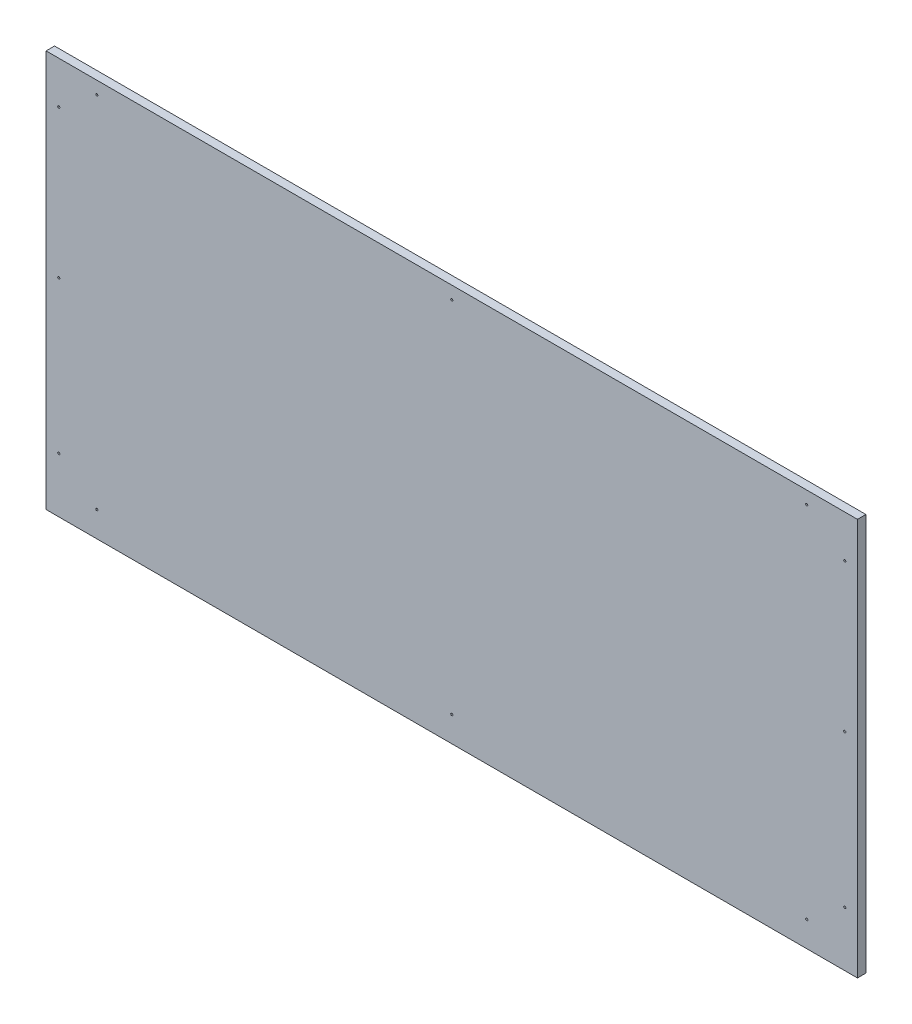
ISO-10303-21;
HEADER;
FILE_DESCRIPTION(('STEP AP214'),'2;1');
FILE_NAME('part.step','',(''),(''),'','','');
FILE_SCHEMA(('AUTOMOTIVE_DESIGN { 1 0 10303 214 1 1 1 1 }'));
ENDSEC;
DATA;
#1=APPLICATION_CONTEXT('core data for automotive mechanical design processes');
#2=APPLICATION_PROTOCOL_DEFINITION('international standard','automotive_design',2000,#1);
#3=PRODUCT_CONTEXT('',#1,'mechanical');
#4=PRODUCT('Part','Part','',(#3));
#5=PRODUCT_RELATED_PRODUCT_CATEGORY('part','',(#4));
#6=PRODUCT_DEFINITION_FORMATION('','',#4);
#7=PRODUCT_DEFINITION_CONTEXT('part definition',#1,'design');
#8=PRODUCT_DEFINITION('design','',#6,#7);
#9=PRODUCT_DEFINITION_SHAPE('','',#8);
#10=(LENGTH_UNIT() NAMED_UNIT(*) SI_UNIT(.MILLI.,.METRE.));
#11=(NAMED_UNIT(*) PLANE_ANGLE_UNIT() SI_UNIT($,.RADIAN.));
#12=(NAMED_UNIT(*) SI_UNIT($,.STERADIAN.) SOLID_ANGLE_UNIT());
#13=UNCERTAINTY_MEASURE_WITH_UNIT(LENGTH_MEASURE(1.E-05),#10,'distance_accuracy_value','');
#14=(GEOMETRIC_REPRESENTATION_CONTEXT(3) GLOBAL_UNCERTAINTY_ASSIGNED_CONTEXT((#13)) GLOBAL_UNIT_ASSIGNED_CONTEXT((#10,
#11,#12)) REPRESENTATION_CONTEXT('',''));
#15=CARTESIAN_POINT('',(0.,0.,0.));
#16=DIRECTION('',(0.,0.,1.));
#17=DIRECTION('',(1.,0.,0.));
#18=AXIS2_PLACEMENT_3D('',#15,#16,#17);
#19=CARTESIAN_POINT('',(0.,0.,-615.95));
#20=DIRECTION('',(0.,0.,-1.));
#21=DIRECTION('',(-1.,0.,0.));
#22=AXIS2_PLACEMENT_3D('',#19,#20,#21);
#23=PLANE('',#22);
#24=CARTESIAN_POINT('',(-590.55,533.4,-615.95));
#25=DIRECTION('',(0.,0.,-1.));
#26=DIRECTION('',(-1.,0.,0.));
#27=AXIS2_PLACEMENT_3D('',#24,#25,#26);
#28=CIRCLE('',#27,1.5875);
#29=CARTESIAN_POINT('',(-592.1375,533.4,-615.95));
#30=VERTEX_POINT('',#29);
#31=EDGE_CURVE('E115',#30,#30,#28,.F.);
#32=ORIENTED_EDGE('',*,*,#31,.T.);
#33=EDGE_LOOP('',(#32));
#34=FACE_BOUND('',#33,.T.);
#35=CARTESIAN_POINT('',(-590.55,82.55,-615.95));
#36=DIRECTION('',(0.,0.,-1.));
#37=DIRECTION('',(-1.,0.,0.));
#38=AXIS2_PLACEMENT_3D('',#35,#36,#37);
#39=CIRCLE('',#38,1.5875);
#40=CARTESIAN_POINT('',(-592.1375,82.55,-615.95));
#41=VERTEX_POINT('',#40);
#42=EDGE_CURVE('E118',#41,#41,#39,.F.);
#43=ORIENTED_EDGE('',*,*,#42,.T.);
#44=EDGE_LOOP('',(#43));
#45=FACE_BOUND('',#44,.T.);
#46=CARTESIAN_POINT('',(590.55,82.55,-615.95));
#47=DIRECTION('',(0.,0.,-1.));
#48=DIRECTION('',(-1.,0.,0.));
#49=AXIS2_PLACEMENT_3D('',#46,#47,#48);
#50=CIRCLE('',#49,1.5875);
#51=CARTESIAN_POINT('',(588.9625,82.55,-615.95));
#52=VERTEX_POINT('',#51);
#53=EDGE_CURVE('E121',#52,#52,#50,.F.);
#54=ORIENTED_EDGE('',*,*,#53,.T.);
#55=EDGE_LOOP('',(#54));
#56=FACE_BOUND('',#55,.T.);
#57=CARTESIAN_POINT('',(590.55,533.4,-615.95));
#58=DIRECTION('',(0.,0.,-1.));
#59=DIRECTION('',(-1.,0.,0.));
#60=AXIS2_PLACEMENT_3D('',#57,#58,#59);
#61=CIRCLE('',#60,1.5875);
#62=CARTESIAN_POINT('',(588.9625,533.4,-615.95));
#63=VERTEX_POINT('',#62);
#64=EDGE_CURVE('E124',#63,#63,#61,.F.);
#65=ORIENTED_EDGE('',*,*,#64,.T.);
#66=EDGE_LOOP('',(#65));
#67=FACE_BOUND('',#66,.T.);
#68=CARTESIAN_POINT('',(-590.55,311.15,-615.95));
#69=DIRECTION('',(0.,0.,-1.));
#70=DIRECTION('',(-1.,0.,0.));
#71=AXIS2_PLACEMENT_3D('',#68,#69,#70);
#72=CIRCLE('',#71,1.5875);
#73=CARTESIAN_POINT('',(-592.1375,311.15,-615.95));
#74=VERTEX_POINT('',#73);
#75=EDGE_CURVE('E127',#74,#74,#72,.F.);
#76=ORIENTED_EDGE('',*,*,#75,.T.);
#77=EDGE_LOOP('',(#76));
#78=FACE_BOUND('',#77,.T.);
#79=CARTESIAN_POINT('',(590.55,311.15,-615.95));
#80=DIRECTION('',(0.,0.,-1.));
#81=DIRECTION('',(-1.,0.,0.));
#82=AXIS2_PLACEMENT_3D('',#79,#80,#81);
#83=CIRCLE('',#82,1.5875);
#84=CARTESIAN_POINT('',(588.9625,311.15,-615.95));
#85=VERTEX_POINT('',#84);
#86=EDGE_CURVE('E130',#85,#85,#83,.F.);
#87=ORIENTED_EDGE('',*,*,#86,.T.);
#88=EDGE_LOOP('',(#87));
#89=FACE_BOUND('',#88,.T.);
#90=CARTESIAN_POINT('',(-533.4,38.1,-615.95));
#91=DIRECTION('',(0.,0.,-1.));
#92=DIRECTION('',(-1.,0.,0.));
#93=AXIS2_PLACEMENT_3D('',#90,#91,#92);
#94=CIRCLE('',#93,1.5875);
#95=CARTESIAN_POINT('',(-534.9875,38.1,-615.95));
#96=VERTEX_POINT('',#95);
#97=EDGE_CURVE('E133',#96,#96,#94,.F.);
#98=ORIENTED_EDGE('',*,*,#97,.T.);
#99=EDGE_LOOP('',(#98));
#100=FACE_BOUND('',#99,.T.);
#101=CARTESIAN_POINT('',(0.,38.1,-615.95));
#102=DIRECTION('',(0.,0.,-1.));
#103=DIRECTION('',(-1.,0.,0.));
#104=AXIS2_PLACEMENT_3D('',#101,#102,#103);
#105=CIRCLE('',#104,1.5875);
#106=CARTESIAN_POINT('',(-1.5875,38.1,-615.95));
#107=VERTEX_POINT('',#106);
#108=EDGE_CURVE('E136',#107,#107,#105,.F.);
#109=ORIENTED_EDGE('',*,*,#108,.T.);
#110=EDGE_LOOP('',(#109));
#111=FACE_BOUND('',#110,.T.);
#112=CARTESIAN_POINT('',(533.4,38.1,-615.95));
#113=DIRECTION('',(0.,0.,-1.));
#114=DIRECTION('',(-1.,0.,0.));
#115=AXIS2_PLACEMENT_3D('',#112,#113,#114);
#116=CIRCLE('',#115,1.5875);
#117=CARTESIAN_POINT('',(531.8125,38.1,-615.95));
#118=VERTEX_POINT('',#117);
#119=EDGE_CURVE('E139',#118,#118,#116,.F.);
#120=ORIENTED_EDGE('',*,*,#119,.T.);
#121=EDGE_LOOP('',(#120));
#122=FACE_BOUND('',#121,.T.);
#123=CARTESIAN_POINT('',(-533.4,577.85,-615.95));
#124=DIRECTION('',(0.,0.,-1.));
#125=DIRECTION('',(-1.,0.,0.));
#126=AXIS2_PLACEMENT_3D('',#123,#124,#125);
#127=CIRCLE('',#126,1.5875);
#128=CARTESIAN_POINT('',(-534.9875,577.85,-615.95));
#129=VERTEX_POINT('',#128);
#130=EDGE_CURVE('E142',#129,#129,#127,.F.);
#131=ORIENTED_EDGE('',*,*,#130,.T.);
#132=EDGE_LOOP('',(#131));
#133=FACE_BOUND('',#132,.T.);
#134=CARTESIAN_POINT('',(0.,577.85,-615.95));
#135=DIRECTION('',(0.,0.,-1.));
#136=DIRECTION('',(-1.,0.,0.));
#137=AXIS2_PLACEMENT_3D('',#134,#135,#136);
#138=CIRCLE('',#137,1.5875);
#139=CARTESIAN_POINT('',(-1.5875,577.85,-615.95));
#140=VERTEX_POINT('',#139);
#141=EDGE_CURVE('E144',#140,#140,#138,.F.);
#142=ORIENTED_EDGE('',*,*,#141,.T.);
#143=EDGE_LOOP('',(#142));
#144=FACE_BOUND('',#143,.T.);
#145=CARTESIAN_POINT('',(533.4,577.85,-615.95));
#146=DIRECTION('',(0.,0.,-1.));
#147=DIRECTION('',(-1.,0.,0.));
#148=AXIS2_PLACEMENT_3D('',#145,#146,#147);
#149=CIRCLE('',#148,1.5875);
#150=CARTESIAN_POINT('',(531.8125,577.85,-615.95));
#151=VERTEX_POINT('',#150);
#152=EDGE_CURVE('E19',#151,#151,#149,.F.);
#153=ORIENTED_EDGE('',*,*,#152,.T.);
#154=EDGE_LOOP('',(#153));
#155=FACE_BOUND('',#154,.T.);
#156=DIRECTION('',(0.,1.,0.));
#157=VECTOR('',#156,1.);
#158=CARTESIAN_POINT('',(609.6,596.9,-615.95));
#159=LINE('',#158,#157);
#160=CARTESIAN_POINT('',(609.6,0.,-615.95));
#161=VERTEX_POINT('',#160);
#162=CARTESIAN_POINT('',(609.6,596.9,-615.95));
#163=VERTEX_POINT('',#162);
#164=EDGE_CURVE('E70',#161,#163,#159,.T.);
#165=ORIENTED_EDGE('',*,*,#164,.F.);
#166=DIRECTION('',(1.,0.,0.));
#167=VECTOR('',#166,1.);
#168=CARTESIAN_POINT('',(609.6,0.,-615.95));
#169=LINE('',#168,#167);
#170=CARTESIAN_POINT('',(-609.6,0.,-615.95));
#171=VERTEX_POINT('',#170);
#172=EDGE_CURVE('E67',#171,#161,#169,.T.);
#173=ORIENTED_EDGE('',*,*,#172,.F.);
#174=DIRECTION('',(0.,1.,0.));
#175=VECTOR('',#174,1.);
#176=CARTESIAN_POINT('',(-609.6,0.,-615.95));
#177=LINE('',#176,#175);
#178=CARTESIAN_POINT('',(-609.6,596.9,-615.95));
#179=VERTEX_POINT('',#178);
#180=EDGE_CURVE('E58',#179,#171,#177,.F.);
#181=ORIENTED_EDGE('',*,*,#180,.F.);
#182=DIRECTION('',(1.,0.,0.));
#183=VECTOR('',#182,1.);
#184=CARTESIAN_POINT('',(-609.6,596.9,-615.95));
#185=LINE('',#184,#183);
#186=EDGE_CURVE('E53',#163,#179,#185,.F.);
#187=ORIENTED_EDGE('',*,*,#186,.F.);
#188=EDGE_LOOP('',(#165,#173,#181,#187));
#189=FACE_BOUND('',#188,.T.);
#190=ADVANCED_FACE('F16',(#34,#45,#56,#67,#78,#89,#100,#111,#122,#133,#144,#155,#189),#23,.T.);
#191=CARTESIAN_POINT('',(609.6,0.,-603.25));
#192=DIRECTION('',(0.,-1.,0.));
#193=DIRECTION('',(0.,0.,-1.));
#194=AXIS2_PLACEMENT_3D('',#191,#192,#193);
#195=PLANE('',#194);
#196=DIRECTION('',(0.,0.,-1.));
#197=VECTOR('',#196,1.);
#198=CARTESIAN_POINT('',(609.6,0.,-603.25));
#199=LINE('',#198,#197);
#200=CARTESIAN_POINT('',(609.6,0.,-603.25));
#201=VERTEX_POINT('',#200);
#202=EDGE_CURVE('E152',#201,#161,#199,.T.);
#203=ORIENTED_EDGE('',*,*,#202,.F.);
#204=DIRECTION('',(-1.,0.,0.));
#205=VECTOR('',#204,1.);
#206=CARTESIAN_POINT('',(0.,0.,-603.25));
#207=LINE('',#206,#205);
#208=CARTESIAN_POINT('',(-609.6,0.,-603.25));
#209=VERTEX_POINT('',#208);
#210=EDGE_CURVE('E77',#201,#209,#207,.T.);
#211=ORIENTED_EDGE('',*,*,#210,.T.);
#212=DIRECTION('',(0.,0.,1.));
#213=VECTOR('',#212,1.);
#214=CARTESIAN_POINT('',(-609.6,0.,-603.25));
#215=LINE('',#214,#213);
#216=EDGE_CURVE('E63',#171,#209,#215,.T.);
#217=ORIENTED_EDGE('',*,*,#216,.F.);
#218=ORIENTED_EDGE('',*,*,#172,.T.);
#219=EDGE_LOOP('',(#203,#211,#217,#218));
#220=FACE_BOUND('',#219,.T.);
#221=ADVANCED_FACE('F76',(#220),#195,.T.);
#222=CARTESIAN_POINT('',(-609.6,0.,-603.25));
#223=DIRECTION('',(-1.,0.,0.));
#224=DIRECTION('',(0.,0.,1.));
#225=AXIS2_PLACEMENT_3D('',#222,#223,#224);
#226=PLANE('',#225);
#227=ORIENTED_EDGE('',*,*,#216,.T.);
#228=DIRECTION('',(0.,1.,0.));
#229=VECTOR('',#228,1.);
#230=CARTESIAN_POINT('',(-609.6,0.,-603.25));
#231=LINE('',#230,#229);
#232=CARTESIAN_POINT('',(-609.6,596.9,-603.25));
#233=VERTEX_POINT('',#232);
#234=EDGE_CURVE('E163',#209,#233,#231,.T.);
#235=ORIENTED_EDGE('',*,*,#234,.T.);
#236=DIRECTION('',(0.,0.,1.));
#237=VECTOR('',#236,1.);
#238=CARTESIAN_POINT('',(-609.6,596.9,-603.25));
#239=LINE('',#238,#237);
#240=EDGE_CURVE('E65',#179,#233,#239,.T.);
#241=ORIENTED_EDGE('',*,*,#240,.F.);
#242=ORIENTED_EDGE('',*,*,#180,.T.);
#243=EDGE_LOOP('',(#227,#235,#241,#242));
#244=FACE_BOUND('',#243,.T.);
#245=ADVANCED_FACE('F60',(#244),#226,.T.);
#246=CARTESIAN_POINT('',(-609.6,596.9,-603.25));
#247=DIRECTION('',(0.,1.,0.));
#248=DIRECTION('',(0.,0.,1.));
#249=AXIS2_PLACEMENT_3D('',#246,#247,#248);
#250=PLANE('',#249);
#251=ORIENTED_EDGE('',*,*,#240,.T.);
#252=DIRECTION('',(-1.,0.,0.));
#253=VECTOR('',#252,1.);
#254=CARTESIAN_POINT('',(0.,596.9,-603.25));
#255=LINE('',#254,#253);
#256=CARTESIAN_POINT('',(609.6,596.9,-603.25));
#257=VERTEX_POINT('',#256);
#258=EDGE_CURVE('E160',#233,#257,#255,.F.);
#259=ORIENTED_EDGE('',*,*,#258,.T.);
#260=DIRECTION('',(0.,0.,-1.));
#261=VECTOR('',#260,1.);
#262=CARTESIAN_POINT('',(609.6,596.9,-603.25));
#263=LINE('',#262,#261);
#264=EDGE_CURVE('E34',#163,#257,#263,.F.);
#265=ORIENTED_EDGE('',*,*,#264,.F.);
#266=ORIENTED_EDGE('',*,*,#186,.T.);
#267=EDGE_LOOP('',(#251,#259,#265,#266));
#268=FACE_BOUND('',#267,.T.);
#269=ADVANCED_FACE('F159',(#268),#250,.T.);
#270=CARTESIAN_POINT('',(609.6,596.9,-603.25));
#271=DIRECTION('',(1.,0.,0.));
#272=DIRECTION('',(0.,0.,-1.));
#273=AXIS2_PLACEMENT_3D('',#270,#271,#272);
#274=PLANE('',#273);
#275=ORIENTED_EDGE('',*,*,#264,.T.);
#276=DIRECTION('',(0.,1.,0.));
#277=VECTOR('',#276,1.);
#278=CARTESIAN_POINT('',(609.6,0.,-603.25));
#279=LINE('',#278,#277);
#280=EDGE_CURVE('E114',#257,#201,#279,.F.);
#281=ORIENTED_EDGE('',*,*,#280,.T.);
#282=ORIENTED_EDGE('',*,*,#202,.T.);
#283=ORIENTED_EDGE('',*,*,#164,.T.);
#284=EDGE_LOOP('',(#275,#281,#282,#283));
#285=FACE_BOUND('',#284,.T.);
#286=ADVANCED_FACE('F166',(#285),#274,.T.);
#287=CARTESIAN_POINT('',(533.4,577.85,-615.95));
#288=DIRECTION('',(0.,0.,-1.));
#289=DIRECTION('',(-1.,0.,0.));
#290=AXIS2_PLACEMENT_3D('',#287,#288,#289);
#291=CYLINDRICAL_SURFACE('',#290,1.5875);
#292=ORIENTED_EDGE('',*,*,#152,.F.);
#293=EDGE_LOOP('',(#292));
#294=FACE_BOUND('',#293,.T.);
#295=CARTESIAN_POINT('',(533.4,577.85,-603.25));
#296=DIRECTION('',(0.,0.,-1.));
#297=DIRECTION('',(-1.,0.,0.));
#298=AXIS2_PLACEMENT_3D('',#295,#296,#297);
#299=CIRCLE('',#298,1.5875);
#300=CARTESIAN_POINT('',(531.8125,577.85,-603.25));
#301=VERTEX_POINT('',#300);
#302=EDGE_CURVE('E111',#301,#301,#299,.F.);
#303=ORIENTED_EDGE('',*,*,#302,.T.);
#304=EDGE_LOOP('',(#303));
#305=FACE_BOUND('',#304,.T.);
#306=ADVANCED_FACE('F168',(#294,#305),#291,.F.);
#307=CARTESIAN_POINT('',(0.,577.85,-615.95));
#308=DIRECTION('',(0.,0.,-1.));
#309=DIRECTION('',(-1.,0.,0.));
#310=AXIS2_PLACEMENT_3D('',#307,#308,#309);
#311=CYLINDRICAL_SURFACE('',#310,1.5875);
#312=ORIENTED_EDGE('',*,*,#141,.F.);
#313=EDGE_LOOP('',(#312));
#314=FACE_BOUND('',#313,.T.);
#315=CARTESIAN_POINT('',(0.,577.85,-603.25));
#316=DIRECTION('',(0.,0.,-1.));
#317=DIRECTION('',(-1.,0.,0.));
#318=AXIS2_PLACEMENT_3D('',#315,#316,#317);
#319=CIRCLE('',#318,1.5875);
#320=CARTESIAN_POINT('',(-1.5875,577.85,-603.25));
#321=VERTEX_POINT('',#320);
#322=EDGE_CURVE('E108',#321,#321,#319,.F.);
#323=ORIENTED_EDGE('',*,*,#322,.T.);
#324=EDGE_LOOP('',(#323));
#325=FACE_BOUND('',#324,.T.);
#326=ADVANCED_FACE('F175',(#314,#325),#311,.F.);
#327=CARTESIAN_POINT('',(-533.4,577.85,-615.95));
#328=DIRECTION('',(0.,0.,-1.));
#329=DIRECTION('',(-1.,0.,0.));
#330=AXIS2_PLACEMENT_3D('',#327,#328,#329);
#331=CYLINDRICAL_SURFACE('',#330,1.5875);
#332=ORIENTED_EDGE('',*,*,#130,.F.);
#333=EDGE_LOOP('',(#332));
#334=FACE_BOUND('',#333,.T.);
#335=CARTESIAN_POINT('',(-533.4,577.85,-603.25));
#336=DIRECTION('',(0.,0.,-1.));
#337=DIRECTION('',(-1.,0.,0.));
#338=AXIS2_PLACEMENT_3D('',#335,#336,#337);
#339=CIRCLE('',#338,1.5875);
#340=CARTESIAN_POINT('',(-534.9875,577.85,-603.25));
#341=VERTEX_POINT('',#340);
#342=EDGE_CURVE('E105',#341,#341,#339,.F.);
#343=ORIENTED_EDGE('',*,*,#342,.T.);
#344=EDGE_LOOP('',(#343));
#345=FACE_BOUND('',#344,.T.);
#346=ADVANCED_FACE('F222',(#334,#345),#331,.F.);
#347=CARTESIAN_POINT('',(533.4,38.1,-615.95));
#348=DIRECTION('',(0.,0.,-1.));
#349=DIRECTION('',(-1.,0.,0.));
#350=AXIS2_PLACEMENT_3D('',#347,#348,#349);
#351=CYLINDRICAL_SURFACE('',#350,1.5875);
#352=ORIENTED_EDGE('',*,*,#119,.F.);
#353=EDGE_LOOP('',(#352));
#354=FACE_BOUND('',#353,.T.);
#355=CARTESIAN_POINT('',(533.4,38.1,-603.25));
#356=DIRECTION('',(0.,0.,-1.));
#357=DIRECTION('',(-1.,0.,0.));
#358=AXIS2_PLACEMENT_3D('',#355,#356,#357);
#359=CIRCLE('',#358,1.5875);
#360=CARTESIAN_POINT('',(531.8125,38.1,-603.25));
#361=VERTEX_POINT('',#360);
#362=EDGE_CURVE('E102',#361,#361,#359,.F.);
#363=ORIENTED_EDGE('',*,*,#362,.T.);
#364=EDGE_LOOP('',(#363));
#365=FACE_BOUND('',#364,.T.);
#366=ADVANCED_FACE('F218',(#354,#365),#351,.F.);
#367=CARTESIAN_POINT('',(0.,38.1,-615.95));
#368=DIRECTION('',(0.,0.,-1.));
#369=DIRECTION('',(-1.,0.,0.));
#370=AXIS2_PLACEMENT_3D('',#367,#368,#369);
#371=CYLINDRICAL_SURFACE('',#370,1.5875);
#372=ORIENTED_EDGE('',*,*,#108,.F.);
#373=EDGE_LOOP('',(#372));
#374=FACE_BOUND('',#373,.T.);
#375=CARTESIAN_POINT('',(0.,38.1,-603.25));
#376=DIRECTION('',(0.,0.,-1.));
#377=DIRECTION('',(-1.,0.,0.));
#378=AXIS2_PLACEMENT_3D('',#375,#376,#377);
#379=CIRCLE('',#378,1.5875);
#380=CARTESIAN_POINT('',(-1.5875,38.1,-603.25));
#381=VERTEX_POINT('',#380);
#382=EDGE_CURVE('E99',#381,#381,#379,.F.);
#383=ORIENTED_EDGE('',*,*,#382,.T.);
#384=EDGE_LOOP('',(#383));
#385=FACE_BOUND('',#384,.T.);
#386=ADVANCED_FACE('F214',(#374,#385),#371,.F.);
#387=CARTESIAN_POINT('',(-533.4,38.1,-615.95));
#388=DIRECTION('',(0.,0.,-1.));
#389=DIRECTION('',(-1.,0.,0.));
#390=AXIS2_PLACEMENT_3D('',#387,#388,#389);
#391=CYLINDRICAL_SURFACE('',#390,1.5875);
#392=ORIENTED_EDGE('',*,*,#97,.F.);
#393=EDGE_LOOP('',(#392));
#394=FACE_BOUND('',#393,.T.);
#395=CARTESIAN_POINT('',(-533.4,38.1,-603.25));
#396=DIRECTION('',(0.,0.,-1.));
#397=DIRECTION('',(-1.,0.,0.));
#398=AXIS2_PLACEMENT_3D('',#395,#396,#397);
#399=CIRCLE('',#398,1.5875);
#400=CARTESIAN_POINT('',(-534.9875,38.1,-603.25));
#401=VERTEX_POINT('',#400);
#402=EDGE_CURVE('E96',#401,#401,#399,.F.);
#403=ORIENTED_EDGE('',*,*,#402,.T.);
#404=EDGE_LOOP('',(#403));
#405=FACE_BOUND('',#404,.T.);
#406=ADVANCED_FACE('F210',(#394,#405),#391,.F.);
#407=CARTESIAN_POINT('',(590.55,311.15,-615.95));
#408=DIRECTION('',(0.,0.,-1.));
#409=DIRECTION('',(-1.,0.,0.));
#410=AXIS2_PLACEMENT_3D('',#407,#408,#409);
#411=CYLINDRICAL_SURFACE('',#410,1.5875);
#412=ORIENTED_EDGE('',*,*,#86,.F.);
#413=EDGE_LOOP('',(#412));
#414=FACE_BOUND('',#413,.T.);
#415=CARTESIAN_POINT('',(590.55,311.15,-603.25));
#416=DIRECTION('',(0.,0.,-1.));
#417=DIRECTION('',(-1.,0.,0.));
#418=AXIS2_PLACEMENT_3D('',#415,#416,#417);
#419=CIRCLE('',#418,1.5875);
#420=CARTESIAN_POINT('',(588.9625,311.15,-603.25));
#421=VERTEX_POINT('',#420);
#422=EDGE_CURVE('E93',#421,#421,#419,.F.);
#423=ORIENTED_EDGE('',*,*,#422,.T.);
#424=EDGE_LOOP('',(#423));
#425=FACE_BOUND('',#424,.T.);
#426=ADVANCED_FACE('F206',(#414,#425),#411,.F.);
#427=CARTESIAN_POINT('',(-590.55,311.15,-615.95));
#428=DIRECTION('',(0.,0.,-1.));
#429=DIRECTION('',(-1.,0.,0.));
#430=AXIS2_PLACEMENT_3D('',#427,#428,#429);
#431=CYLINDRICAL_SURFACE('',#430,1.5875);
#432=ORIENTED_EDGE('',*,*,#75,.F.);
#433=EDGE_LOOP('',(#432));
#434=FACE_BOUND('',#433,.T.);
#435=CARTESIAN_POINT('',(-590.55,311.15,-603.25));
#436=DIRECTION('',(0.,0.,-1.));
#437=DIRECTION('',(-1.,0.,0.));
#438=AXIS2_PLACEMENT_3D('',#435,#436,#437);
#439=CIRCLE('',#438,1.5875);
#440=CARTESIAN_POINT('',(-592.1375,311.15,-603.25));
#441=VERTEX_POINT('',#440);
#442=EDGE_CURVE('E90',#441,#441,#439,.F.);
#443=ORIENTED_EDGE('',*,*,#442,.T.);
#444=EDGE_LOOP('',(#443));
#445=FACE_BOUND('',#444,.T.);
#446=ADVANCED_FACE('F202',(#434,#445),#431,.F.);
#447=CARTESIAN_POINT('',(590.55,533.4,-615.95));
#448=DIRECTION('',(0.,0.,-1.));
#449=DIRECTION('',(-1.,0.,0.));
#450=AXIS2_PLACEMENT_3D('',#447,#448,#449);
#451=CYLINDRICAL_SURFACE('',#450,1.5875);
#452=ORIENTED_EDGE('',*,*,#64,.F.);
#453=EDGE_LOOP('',(#452));
#454=FACE_BOUND('',#453,.T.);
#455=CARTESIAN_POINT('',(590.55,533.4,-603.25));
#456=DIRECTION('',(0.,0.,-1.));
#457=DIRECTION('',(-1.,0.,0.));
#458=AXIS2_PLACEMENT_3D('',#455,#456,#457);
#459=CIRCLE('',#458,1.5875);
#460=CARTESIAN_POINT('',(588.9625,533.4,-603.25));
#461=VERTEX_POINT('',#460);
#462=EDGE_CURVE('E87',#461,#461,#459,.F.);
#463=ORIENTED_EDGE('',*,*,#462,.T.);
#464=EDGE_LOOP('',(#463));
#465=FACE_BOUND('',#464,.T.);
#466=ADVANCED_FACE('F198',(#454,#465),#451,.F.);
#467=CARTESIAN_POINT('',(590.55,82.55,-615.95));
#468=DIRECTION('',(0.,0.,-1.));
#469=DIRECTION('',(-1.,0.,0.));
#470=AXIS2_PLACEMENT_3D('',#467,#468,#469);
#471=CYLINDRICAL_SURFACE('',#470,1.5875);
#472=ORIENTED_EDGE('',*,*,#53,.F.);
#473=EDGE_LOOP('',(#472));
#474=FACE_BOUND('',#473,.T.);
#475=CARTESIAN_POINT('',(590.55,82.55,-603.25));
#476=DIRECTION('',(0.,0.,-1.));
#477=DIRECTION('',(-1.,0.,0.));
#478=AXIS2_PLACEMENT_3D('',#475,#476,#477);
#479=CIRCLE('',#478,1.5875);
#480=CARTESIAN_POINT('',(588.9625,82.55,-603.25));
#481=VERTEX_POINT('',#480);
#482=EDGE_CURVE('E84',#481,#481,#479,.F.);
#483=ORIENTED_EDGE('',*,*,#482,.T.);
#484=EDGE_LOOP('',(#483));
#485=FACE_BOUND('',#484,.T.);
#486=ADVANCED_FACE('F194',(#474,#485),#471,.F.);
#487=CARTESIAN_POINT('',(-590.55,82.55,-615.95));
#488=DIRECTION('',(0.,0.,-1.));
#489=DIRECTION('',(-1.,0.,0.));
#490=AXIS2_PLACEMENT_3D('',#487,#488,#489);
#491=CYLINDRICAL_SURFACE('',#490,1.5875);
#492=ORIENTED_EDGE('',*,*,#42,.F.);
#493=EDGE_LOOP('',(#492));
#494=FACE_BOUND('',#493,.T.);
#495=CARTESIAN_POINT('',(-590.55,82.55,-603.25));
#496=DIRECTION('',(0.,0.,-1.));
#497=DIRECTION('',(-1.,0.,0.));
#498=AXIS2_PLACEMENT_3D('',#495,#496,#497);
#499=CIRCLE('',#498,1.5875);
#500=CARTESIAN_POINT('',(-592.1375,82.55,-603.25));
#501=VERTEX_POINT('',#500);
#502=EDGE_CURVE('E25',#501,#501,#499,.F.);
#503=ORIENTED_EDGE('',*,*,#502,.T.);
#504=EDGE_LOOP('',(#503));
#505=FACE_BOUND('',#504,.T.);
#506=ADVANCED_FACE('F186',(#494,#505),#491,.F.);
#507=CARTESIAN_POINT('',(-590.55,533.4,-615.95));
#508=DIRECTION('',(0.,0.,-1.));
#509=DIRECTION('',(-1.,0.,0.));
#510=AXIS2_PLACEMENT_3D('',#507,#508,#509);
#511=CYLINDRICAL_SURFACE('',#510,1.5875);
#512=ORIENTED_EDGE('',*,*,#31,.F.);
#513=EDGE_LOOP('',(#512));
#514=FACE_BOUND('',#513,.T.);
#515=CARTESIAN_POINT('',(-590.55,533.4,-603.25));
#516=DIRECTION('',(0.,0.,-1.));
#517=DIRECTION('',(-1.,0.,0.));
#518=AXIS2_PLACEMENT_3D('',#515,#516,#517);
#519=CIRCLE('',#518,1.5875);
#520=CARTESIAN_POINT('',(-592.1375,533.4,-603.25));
#521=VERTEX_POINT('',#520);
#522=EDGE_CURVE('E11',#521,#521,#519,.F.);
#523=ORIENTED_EDGE('',*,*,#522,.T.);
#524=EDGE_LOOP('',(#523));
#525=FACE_BOUND('',#524,.T.);
#526=ADVANCED_FACE('F180',(#514,#525),#511,.F.);
#527=CARTESIAN_POINT('',(0.,0.,-603.25));
#528=DIRECTION('',(0.,0.,-1.));
#529=DIRECTION('',(-1.,0.,0.));
#530=AXIS2_PLACEMENT_3D('',#527,#528,#529);
#531=PLANE('',#530);
#532=ORIENTED_EDGE('',*,*,#522,.F.);
#533=EDGE_LOOP('',(#532));
#534=FACE_BOUND('',#533,.T.);
#535=ORIENTED_EDGE('',*,*,#502,.F.);
#536=EDGE_LOOP('',(#535));
#537=FACE_BOUND('',#536,.T.);
#538=ORIENTED_EDGE('',*,*,#482,.F.);
#539=EDGE_LOOP('',(#538));
#540=FACE_BOUND('',#539,.T.);
#541=ORIENTED_EDGE('',*,*,#462,.F.);
#542=EDGE_LOOP('',(#541));
#543=FACE_BOUND('',#542,.T.);
#544=ORIENTED_EDGE('',*,*,#442,.F.);
#545=EDGE_LOOP('',(#544));
#546=FACE_BOUND('',#545,.T.);
#547=ORIENTED_EDGE('',*,*,#422,.F.);
#548=EDGE_LOOP('',(#547));
#549=FACE_BOUND('',#548,.T.);
#550=ORIENTED_EDGE('',*,*,#402,.F.);
#551=EDGE_LOOP('',(#550));
#552=FACE_BOUND('',#551,.T.);
#553=ORIENTED_EDGE('',*,*,#382,.F.);
#554=EDGE_LOOP('',(#553));
#555=FACE_BOUND('',#554,.T.);
#556=ORIENTED_EDGE('',*,*,#362,.F.);
#557=EDGE_LOOP('',(#556));
#558=FACE_BOUND('',#557,.T.);
#559=ORIENTED_EDGE('',*,*,#342,.F.);
#560=EDGE_LOOP('',(#559));
#561=FACE_BOUND('',#560,.T.);
#562=ORIENTED_EDGE('',*,*,#322,.F.);
#563=EDGE_LOOP('',(#562));
#564=FACE_BOUND('',#563,.T.);
#565=ORIENTED_EDGE('',*,*,#302,.F.);
#566=EDGE_LOOP('',(#565));
#567=FACE_BOUND('',#566,.T.);
#568=ORIENTED_EDGE('',*,*,#258,.F.);
#569=ORIENTED_EDGE('',*,*,#234,.F.);
#570=ORIENTED_EDGE('',*,*,#210,.F.);
#571=ORIENTED_EDGE('',*,*,#280,.F.);
#572=EDGE_LOOP('',(#568,#569,#570,#571));
#573=FACE_BOUND('',#572,.T.);
#574=ADVANCED_FACE('F162',(#534,#537,#540,#543,#546,#549,#552,#555,#558,#561,#564,#567,#573),
#531,.F.);
#575=CLOSED_SHELL('',(#190,#221,#245,#269,#286,#306,#326,#346,#366,#386,#406,#426,#446,#466,
#486,#506,#526,#574));
#576=MANIFOLD_SOLID_BREP('B1',#575);
#577=ADVANCED_BREP_SHAPE_REPRESENTATION('',(#18,#576),#14);
#578=SHAPE_DEFINITION_REPRESENTATION(#9,#577);
ENDSEC;
END-ISO-10303-21;
